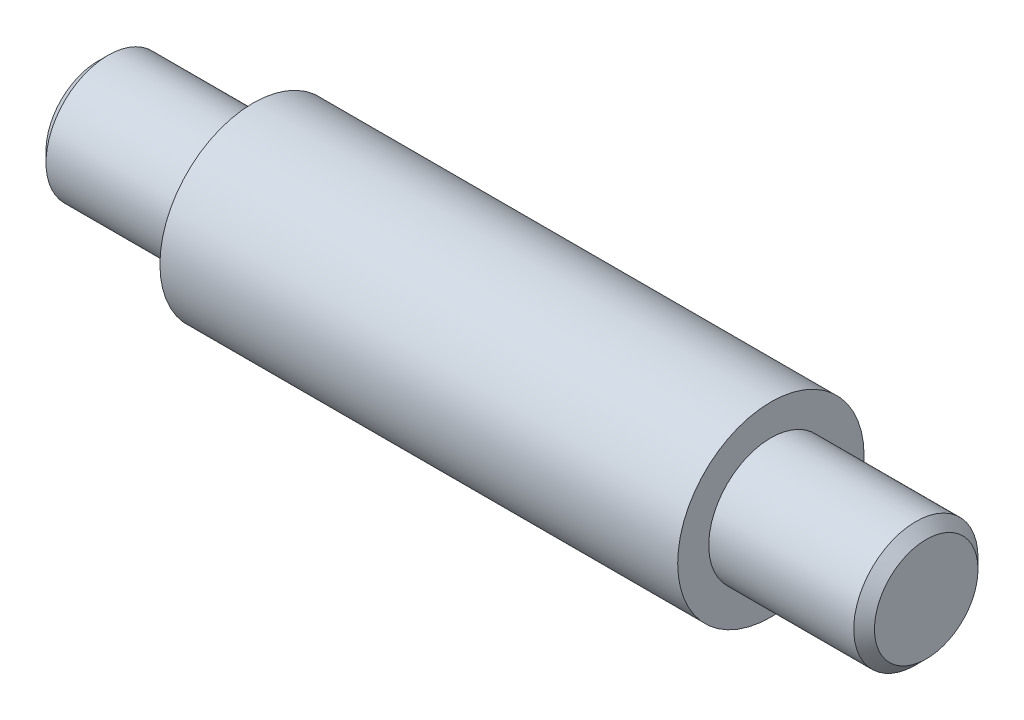
ISO-10303-21;
HEADER;
FILE_DESCRIPTION(('STEP AP214'),'2;1');
FILE_NAME('part.step','',(''),(''),'','','');
FILE_SCHEMA(('AUTOMOTIVE_DESIGN { 1 0 10303 214 1 1 1 1 }'));
ENDSEC;
DATA;
#1=APPLICATION_CONTEXT('core data for automotive mechanical design processes');
#2=APPLICATION_PROTOCOL_DEFINITION('international standard','automotive_design',2000,#1);
#3=PRODUCT_CONTEXT('',#1,'mechanical');
#4=PRODUCT('Part','Part','',(#3));
#5=PRODUCT_RELATED_PRODUCT_CATEGORY('part','',(#4));
#6=PRODUCT_DEFINITION_FORMATION('','',#4);
#7=PRODUCT_DEFINITION_CONTEXT('part definition',#1,'design');
#8=PRODUCT_DEFINITION('design','',#6,#7);
#9=PRODUCT_DEFINITION_SHAPE('','',#8);
#10=(LENGTH_UNIT() NAMED_UNIT(*) SI_UNIT(.MILLI.,.METRE.));
#11=(NAMED_UNIT(*) PLANE_ANGLE_UNIT() SI_UNIT($,.RADIAN.));
#12=(NAMED_UNIT(*) SI_UNIT($,.STERADIAN.) SOLID_ANGLE_UNIT());
#13=UNCERTAINTY_MEASURE_WITH_UNIT(LENGTH_MEASURE(1.E-05),#10,'distance_accuracy_value','');
#14=(GEOMETRIC_REPRESENTATION_CONTEXT(3) GLOBAL_UNCERTAINTY_ASSIGNED_CONTEXT((#13)) GLOBAL_UNIT_ASSIGNED_CONTEXT((#10,
#11,#12)) REPRESENTATION_CONTEXT('',''));
#15=CARTESIAN_POINT('',(0.,0.,0.));
#16=DIRECTION('',(0.,0.,1.));
#17=DIRECTION('',(1.,0.,0.));
#18=AXIS2_PLACEMENT_3D('',#15,#16,#17);
#19=CARTESIAN_POINT('',(0.,0.,0.));
#20=DIRECTION('',(-1.,0.,0.));
#21=DIRECTION('',(0.,0.,1.));
#22=AXIS2_PLACEMENT_3D('',#19,#20,#21);
#23=PLANE('',#22);
#24=CARTESIAN_POINT('',(0.,0.,0.));
#25=DIRECTION('',(1.,0.,0.));
#26=DIRECTION('',(0.,0.,-1.));
#27=AXIS2_PLACEMENT_3D('',#24,#25,#26);
#28=CIRCLE('',#27,5.);
#29=CARTESIAN_POINT('',(0.,0.,-5.));
#30=VERTEX_POINT('',#29);
#31=EDGE_CURVE('E10',#30,#30,#28,.T.);
#32=ORIENTED_EDGE('',*,*,#31,.F.);
#33=EDGE_LOOP('',(#32));
#34=FACE_BOUND('',#33,.T.);
#35=ADVANCED_FACE('F31',(#34),#23,.T.);
#36=CARTESIAN_POINT('',(1.,0.,0.));
#37=DIRECTION('',(1.,0.,0.));
#38=DIRECTION('',(0.,0.,-1.));
#39=AXIS2_PLACEMENT_3D('',#36,#37,#38);
#40=CONICAL_SURFACE('',#39,6.,0.785398163397448);
#41=ORIENTED_EDGE('',*,*,#31,.T.);
#42=EDGE_LOOP('',(#41));
#43=FACE_BOUND('',#42,.T.);
#44=CARTESIAN_POINT('',(1.,0.,0.));
#45=DIRECTION('',(1.,0.,0.));
#46=DIRECTION('',(0.,0.,-1.));
#47=AXIS2_PLACEMENT_3D('',#44,#45,#46);
#48=CIRCLE('',#47,6.);
#49=CARTESIAN_POINT('',(1.,0.,-6.));
#50=VERTEX_POINT('',#49);
#51=EDGE_CURVE('E37',#50,#50,#48,.T.);
#52=ORIENTED_EDGE('',*,*,#51,.F.);
#53=EDGE_LOOP('',(#52));
#54=FACE_BOUND('',#53,.T.);
#55=ADVANCED_FACE('F79',(#43,#54),#40,.T.);
#56=CARTESIAN_POINT('',(80.,0.,0.));
#57=DIRECTION('',(1.,0.,0.));
#58=DIRECTION('',(0.,0.,-1.));
#59=AXIS2_PLACEMENT_3D('',#56,#57,#58);
#60=CYLINDRICAL_SURFACE('',#59,6.);
#61=ORIENTED_EDGE('',*,*,#51,.T.);
#62=EDGE_LOOP('',(#61));
#63=FACE_BOUND('',#62,.T.);
#64=CARTESIAN_POINT('',(15.,0.,0.));
#65=DIRECTION('',(1.,0.,0.));
#66=DIRECTION('',(0.,0.,-1.));
#67=AXIS2_PLACEMENT_3D('',#64,#65,#66);
#68=CIRCLE('',#67,6.);
#69=CARTESIAN_POINT('',(15.,0.,-6.));
#70=VERTEX_POINT('',#69);
#71=EDGE_CURVE('E41',#70,#70,#68,.T.);
#72=ORIENTED_EDGE('',*,*,#71,.F.);
#73=EDGE_LOOP('',(#72));
#74=FACE_BOUND('',#73,.T.);
#75=ADVANCED_FACE('F84',(#63,#74),#60,.T.);
#76=CARTESIAN_POINT('',(15.,6.,0.));
#77=DIRECTION('',(-1.,0.,0.));
#78=DIRECTION('',(0.,0.,1.));
#79=AXIS2_PLACEMENT_3D('',#76,#77,#78);
#80=PLANE('',#79);
#81=ORIENTED_EDGE('',*,*,#71,.T.);
#82=EDGE_LOOP('',(#81));
#83=FACE_BOUND('',#82,.T.);
#84=CARTESIAN_POINT('',(15.,0.,0.));
#85=DIRECTION('',(1.,0.,0.));
#86=DIRECTION('',(0.,0.,-1.));
#87=AXIS2_PLACEMENT_3D('',#84,#85,#86);
#88=CIRCLE('',#87,9.);
#89=CARTESIAN_POINT('',(15.,0.,-9.));
#90=VERTEX_POINT('',#89);
#91=EDGE_CURVE('E45',#90,#90,#88,.T.);
#92=ORIENTED_EDGE('',*,*,#91,.F.);
#93=EDGE_LOOP('',(#92));
#94=FACE_BOUND('',#93,.T.);
#95=ADVANCED_FACE('F88',(#83,#94),#80,.T.);
#96=CARTESIAN_POINT('',(80.,0.,0.));
#97=DIRECTION('',(1.,0.,0.));
#98=DIRECTION('',(0.,0.,-1.));
#99=AXIS2_PLACEMENT_3D('',#96,#97,#98);
#100=CYLINDRICAL_SURFACE('',#99,9.);
#101=ORIENTED_EDGE('',*,*,#91,.T.);
#102=EDGE_LOOP('',(#101));
#103=FACE_BOUND('',#102,.T.);
#104=CARTESIAN_POINT('',(65.,0.,0.));
#105=DIRECTION('',(1.,0.,0.));
#106=DIRECTION('',(0.,0.,-1.));
#107=AXIS2_PLACEMENT_3D('',#104,#105,#106);
#108=CIRCLE('',#107,9.);
#109=CARTESIAN_POINT('',(65.,0.,-9.));
#110=VERTEX_POINT('',#109);
#111=EDGE_CURVE('E50',#110,#110,#108,.T.);
#112=ORIENTED_EDGE('',*,*,#111,.F.);
#113=EDGE_LOOP('',(#112));
#114=FACE_BOUND('',#113,.T.);
#115=ADVANCED_FACE('F94',(#103,#114),#100,.T.);
#116=CARTESIAN_POINT('',(65.,9.,0.));
#117=DIRECTION('',(1.,0.,0.));
#118=DIRECTION('',(0.,0.,-1.));
#119=AXIS2_PLACEMENT_3D('',#116,#117,#118);
#120=PLANE('',#119);
#121=ORIENTED_EDGE('',*,*,#111,.T.);
#122=EDGE_LOOP('',(#121));
#123=FACE_BOUND('',#122,.T.);
#124=CARTESIAN_POINT('',(65.,0.,0.));
#125=DIRECTION('',(1.,0.,0.));
#126=DIRECTION('',(0.,0.,-1.));
#127=AXIS2_PLACEMENT_3D('',#124,#125,#126);
#128=CIRCLE('',#127,6.);
#129=CARTESIAN_POINT('',(65.,0.,-6.));
#130=VERTEX_POINT('',#129);
#131=EDGE_CURVE('E53',#130,#130,#128,.T.);
#132=ORIENTED_EDGE('',*,*,#131,.F.);
#133=EDGE_LOOP('',(#132));
#134=FACE_BOUND('',#133,.T.);
#135=ADVANCED_FACE('F75',(#123,#134),#120,.T.);
#136=CARTESIAN_POINT('',(80.,0.,0.));
#137=DIRECTION('',(1.,0.,0.));
#138=DIRECTION('',(0.,0.,-1.));
#139=AXIS2_PLACEMENT_3D('',#136,#137,#138);
#140=CYLINDRICAL_SURFACE('',#139,6.);
#141=ORIENTED_EDGE('',*,*,#131,.T.);
#142=EDGE_LOOP('',(#141));
#143=FACE_BOUND('',#142,.T.);
#144=CARTESIAN_POINT('',(79.,0.,0.));
#145=DIRECTION('',(1.,0.,0.));
#146=DIRECTION('',(0.,0.,-1.));
#147=AXIS2_PLACEMENT_3D('',#144,#145,#146);
#148=CIRCLE('',#147,6.);
#149=CARTESIAN_POINT('',(79.,0.,-6.));
#150=VERTEX_POINT('',#149);
#151=EDGE_CURVE('E56',#150,#150,#148,.T.);
#152=ORIENTED_EDGE('',*,*,#151,.F.);
#153=EDGE_LOOP('',(#152));
#154=FACE_BOUND('',#153,.T.);
#155=ADVANCED_FACE('F67',(#143,#154),#140,.T.);
#156=CARTESIAN_POINT('',(80.,0.,0.));
#157=DIRECTION('',(-1.,0.,0.));
#158=DIRECTION('',(0.,0.,1.));
#159=AXIS2_PLACEMENT_3D('',#156,#157,#158);
#160=CONICAL_SURFACE('',#159,5.,0.785398163397448);
#161=ORIENTED_EDGE('',*,*,#151,.T.);
#162=EDGE_LOOP('',(#161));
#163=FACE_BOUND('',#162,.T.);
#164=CARTESIAN_POINT('',(80.,0.,0.));
#165=DIRECTION('',(1.,0.,0.));
#166=DIRECTION('',(0.,0.,-1.));
#167=AXIS2_PLACEMENT_3D('',#164,#165,#166);
#168=CIRCLE('',#167,5.);
#169=CARTESIAN_POINT('',(80.,0.,-5.));
#170=VERTEX_POINT('',#169);
#171=EDGE_CURVE('E59',#170,#170,#168,.T.);
#172=ORIENTED_EDGE('',*,*,#171,.F.);
#173=EDGE_LOOP('',(#172));
#174=FACE_BOUND('',#173,.T.);
#175=ADVANCED_FACE('F65',(#163,#174),#160,.T.);
#176=CARTESIAN_POINT('',(80.,5.,0.));
#177=DIRECTION('',(1.,0.,0.));
#178=DIRECTION('',(0.,0.,-1.));
#179=AXIS2_PLACEMENT_3D('',#176,#177,#178);
#180=PLANE('',#179);
#181=ORIENTED_EDGE('',*,*,#171,.T.);
#182=EDGE_LOOP('',(#181));
#183=FACE_BOUND('',#182,.T.);
#184=ADVANCED_FACE('F63',(#183),#180,.T.);
#185=CLOSED_SHELL('',(#35,#55,#75,#95,#115,#135,#155,#175,#184));
#186=MANIFOLD_SOLID_BREP('B2',#185);
#187=ADVANCED_BREP_SHAPE_REPRESENTATION('',(#18,#186),#14);
#188=SHAPE_DEFINITION_REPRESENTATION(#9,#187);
ENDSEC;
END-ISO-10303-21;
